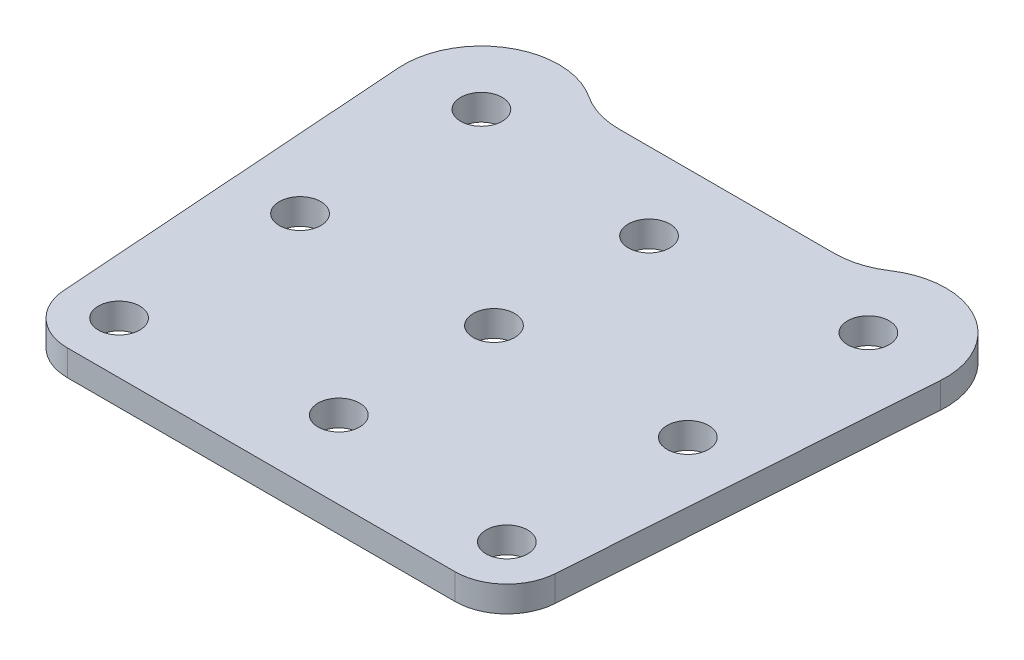
ISO-10303-21;
HEADER;
FILE_DESCRIPTION(('STEP AP214'),'2;1');
FILE_NAME('part.step','',(''),(''),'','','');
FILE_SCHEMA(('AUTOMOTIVE_DESIGN { 1 0 10303 214 1 1 1 1 }'));
ENDSEC;
DATA;
#1=APPLICATION_CONTEXT('core data for automotive mechanical design processes');
#2=APPLICATION_PROTOCOL_DEFINITION('international standard','automotive_design',2000,#1);
#3=PRODUCT_CONTEXT('',#1,'mechanical');
#4=PRODUCT('Part','Part','',(#3));
#5=PRODUCT_RELATED_PRODUCT_CATEGORY('part','',(#4));
#6=PRODUCT_DEFINITION_FORMATION('','',#4);
#7=PRODUCT_DEFINITION_CONTEXT('part definition',#1,'design');
#8=PRODUCT_DEFINITION('design','',#6,#7);
#9=PRODUCT_DEFINITION_SHAPE('','',#8);
#10=(LENGTH_UNIT() NAMED_UNIT(*) SI_UNIT(.MILLI.,.METRE.));
#11=(NAMED_UNIT(*) PLANE_ANGLE_UNIT() SI_UNIT($,.RADIAN.));
#12=(NAMED_UNIT(*) SI_UNIT($,.STERADIAN.) SOLID_ANGLE_UNIT());
#13=UNCERTAINTY_MEASURE_WITH_UNIT(LENGTH_MEASURE(1.E-05),#10,'distance_accuracy_value','');
#14=(GEOMETRIC_REPRESENTATION_CONTEXT(3) GLOBAL_UNCERTAINTY_ASSIGNED_CONTEXT((#13)) GLOBAL_UNIT_ASSIGNED_CONTEXT((#10,
#11,#12)) REPRESENTATION_CONTEXT('',''));
#15=CARTESIAN_POINT('',(0.,0.,0.));
#16=DIRECTION('',(0.,0.,1.));
#17=DIRECTION('',(1.,0.,0.));
#18=AXIS2_PLACEMENT_3D('',#15,#16,#17);
#19=CARTESIAN_POINT('',(-23.7635034,3.175,-31.7500000000001));
#20=DIRECTION('',(0.,1.,0.));
#21=DIRECTION('',(0.,0.,1.));
#22=AXIS2_PLACEMENT_3D('',#19,#20,#21);
#23=PLANE('',#22);
#24=CARTESIAN_POINT('',(23.8125,3.175,-9.52500000000001));
#25=DIRECTION('',(0.,-1.,0.));
#26=DIRECTION('',(0.,0.,-1.));
#27=AXIS2_PLACEMENT_3D('',#24,#25,#26);
#28=CIRCLE('',#27,2.5527);
#29=CARTESIAN_POINT('',(23.8125,3.175,-12.0777));
#30=VERTEX_POINT('',#29);
#31=EDGE_CURVE('E188',#30,#30,#28,.T.);
#32=ORIENTED_EDGE('',*,*,#31,.T.);
#33=EDGE_LOOP('',(#32));
#34=FACE_BOUND('',#33,.T.);
#35=CARTESIAN_POINT('',(23.8125,3.175,12.7));
#36=DIRECTION('',(0.,-1.,0.));
#37=DIRECTION('',(0.,0.,-1.));
#38=AXIS2_PLACEMENT_3D('',#35,#36,#37);
#39=CIRCLE('',#38,2.55269999999999);
#40=CARTESIAN_POINT('',(23.8125,3.175,10.1473000000001));
#41=VERTEX_POINT('',#40);
#42=EDGE_CURVE('E196',#41,#41,#39,.T.);
#43=ORIENTED_EDGE('',*,*,#42,.T.);
#44=EDGE_LOOP('',(#43));
#45=FACE_BOUND('',#44,.T.);
#46=CARTESIAN_POINT('',(0.,3.175,-28.575));
#47=DIRECTION('',(0.,-1.,0.));
#48=DIRECTION('',(0.,0.,-1.));
#49=AXIS2_PLACEMENT_3D('',#46,#47,#48);
#50=CIRCLE('',#49,2.5527);
#51=CARTESIAN_POINT('',(0.,3.175,-31.1277));
#52=VERTEX_POINT('',#51);
#53=EDGE_CURVE('E206',#52,#52,#50,.T.);
#54=ORIENTED_EDGE('',*,*,#53,.T.);
#55=EDGE_LOOP('',(#54));
#56=FACE_BOUND('',#55,.T.);
#57=CARTESIAN_POINT('',(0.,3.175,-9.52500000000001));
#58=DIRECTION('',(0.,-1.,0.));
#59=DIRECTION('',(0.,0.,-1.));
#60=AXIS2_PLACEMENT_3D('',#57,#58,#59);
#61=CIRCLE('',#60,2.5527);
#62=CARTESIAN_POINT('',(0.,3.175,-12.0777));
#63=VERTEX_POINT('',#62);
#64=EDGE_CURVE('E216',#63,#63,#61,.T.);
#65=ORIENTED_EDGE('',*,*,#64,.T.);
#66=EDGE_LOOP('',(#65));
#67=FACE_BOUND('',#66,.T.);
#68=CARTESIAN_POINT('',(-23.7635034,3.175,-31.7500000000001));
#69=DIRECTION('',(0.,-1.,0.));
#70=DIRECTION('',(0.,0.,-1.));
#71=AXIS2_PLACEMENT_3D('',#68,#69,#70);
#72=CIRCLE('',#71,2.5527);
#73=CARTESIAN_POINT('',(-23.7635034,3.175,-34.3027000000001));
#74=VERTEX_POINT('',#73);
#75=EDGE_CURVE('E226',#74,#74,#72,.T.);
#76=ORIENTED_EDGE('',*,*,#75,.T.);
#77=EDGE_LOOP('',(#76));
#78=FACE_BOUND('',#77,.T.);
#79=DIRECTION('',(1.,0.,0.));
#80=VECTOR('',#79,1.);
#81=CARTESIAN_POINT('',(-13.2332196906216,3.175,-38.1));
#82=LINE('',#81,#80);
#83=CARTESIAN_POINT('',(13.2332196906216,3.175,-38.1));
#84=VERTEX_POINT('',#83);
#85=CARTESIAN_POINT('',(-13.2332196906216,3.175,-38.1));
#86=VERTEX_POINT('',#85);
#87=EDGE_CURVE('E117',#84,#86,#82,.F.);
#88=ORIENTED_EDGE('',*,*,#87,.T.);
#89=CARTESIAN_POINT('',(-13.2332196906216,3.175,-47.625));
#90=DIRECTION('',(0.,-1.,0.));
#91=DIRECTION('',(0.,0.,-1.));
#92=AXIS2_PLACEMENT_3D('',#89,#90,#91);
#93=CIRCLE('',#92,9.52500000000001);
#94=CARTESIAN_POINT('',(-18.4983615453108,3.175,-39.6875));
#95=VERTEX_POINT('',#94);
#96=EDGE_CURVE('E235',#86,#95,#93,.T.);
#97=ORIENTED_EDGE('',*,*,#96,.T.);
#98=CARTESIAN_POINT('',(-23.7635034,3.175,-31.7500000000001));
#99=DIRECTION('',(0.,-1.,0.));
#100=DIRECTION('',(0.,0.,-1.));
#101=AXIS2_PLACEMENT_3D('',#98,#99,#100);
#102=CIRCLE('',#101,9.52500000000001);
#103=CARTESIAN_POINT('',(-33.2649180631843,3.175,-31.0801161307916));
#104=VERTEX_POINT('',#103);
#105=EDGE_CURVE('E103',#104,#95,#102,.T.);
#106=ORIENTED_EDGE('',*,*,#105,.F.);
#107=DIRECTION('',(-0.0703290151399907,0.,-0.997523849153211));
#108=VECTOR('',#107,1.);
#109=CARTESIAN_POINT('',(-33.2649180631843,3.175,-31.0801161307916));
#110=LINE('',#109,#108);
#111=CARTESIAN_POINT('',(-30.1467764421229,3.175,13.1465892461389));
#112=VERTEX_POINT('',#111);
#113=EDGE_CURVE('E99',#104,#112,#110,.F.);
#114=ORIENTED_EDGE('',*,*,#113,.T.);
#115=CARTESIAN_POINT('',(-23.8125,3.175,12.6999999999999));
#116=DIRECTION('',(0.,-1.,0.));
#117=DIRECTION('',(0.,0.,-1.));
#118=AXIS2_PLACEMENT_3D('',#115,#116,#117);
#119=CIRCLE('',#118,6.35);
#120=CARTESIAN_POINT('',(-23.8125,3.175,19.05));
#121=VERTEX_POINT('',#120);
#122=EDGE_CURVE('E19',#121,#112,#119,.T.);
#123=ORIENTED_EDGE('',*,*,#122,.F.);
#124=DIRECTION('',(-1.,0.,0.));
#125=VECTOR('',#124,1.);
#126=CARTESIAN_POINT('',(-23.8125,3.175,19.05));
#127=LINE('',#126,#125);
#128=CARTESIAN_POINT('',(23.8125,3.175,19.05));
#129=VERTEX_POINT('',#128);
#130=EDGE_CURVE('E113',#121,#129,#127,.F.);
#131=ORIENTED_EDGE('',*,*,#130,.T.);
#132=CARTESIAN_POINT('',(23.8125,3.175,12.7));
#133=DIRECTION('',(0.,-1.,0.));
#134=DIRECTION('',(0.,0.,-1.));
#135=AXIS2_PLACEMENT_3D('',#132,#133,#134);
#136=CIRCLE('',#135,6.35);
#137=CARTESIAN_POINT('',(30.1467764421229,3.175,13.146589246139));
#138=VERTEX_POINT('',#137);
#139=EDGE_CURVE('E126',#138,#129,#136,.T.);
#140=ORIENTED_EDGE('',*,*,#139,.F.);
#141=DIRECTION('',(-0.0703290151399901,0.,0.997523849153211));
#142=VECTOR('',#141,1.);
#143=CARTESIAN_POINT('',(33.2649180631843,3.175,-31.0801161307915));
#144=LINE('',#143,#142);
#145=CARTESIAN_POINT('',(33.2649180631843,3.175,-31.0801161307915));
#146=VERTEX_POINT('',#145);
#147=EDGE_CURVE('E121',#138,#146,#144,.F.);
#148=ORIENTED_EDGE('',*,*,#147,.T.);
#149=CARTESIAN_POINT('',(23.7635034,3.175,-31.7499999999999));
#150=DIRECTION('',(0.,-1.,0.));
#151=DIRECTION('',(0.,0.,-1.));
#152=AXIS2_PLACEMENT_3D('',#149,#150,#151);
#153=CIRCLE('',#152,9.52500000000001);
#154=CARTESIAN_POINT('',(18.4983615453108,3.175,-39.6875));
#155=VERTEX_POINT('',#154);
#156=EDGE_CURVE('E124',#155,#146,#153,.T.);
#157=ORIENTED_EDGE('',*,*,#156,.F.);
#158=CARTESIAN_POINT('',(13.2332196906216,3.175,-47.625));
#159=DIRECTION('',(0.,-1.,0.));
#160=DIRECTION('',(0.,0.,-1.));
#161=AXIS2_PLACEMENT_3D('',#158,#159,#160);
#162=CIRCLE('',#161,9.52500000000001);
#163=EDGE_CURVE('E237',#155,#84,#162,.T.);
#164=ORIENTED_EDGE('',*,*,#163,.T.);
#165=EDGE_LOOP('',(#88,#97,#106,#114,#123,#131,#140,#148,#157,#164));
#166=FACE_BOUND('',#165,.T.);
#167=CARTESIAN_POINT('',(23.7635034,3.175,-31.7499999999999));
#168=DIRECTION('',(0.,-1.,0.));
#169=DIRECTION('',(0.,0.,-1.));
#170=AXIS2_PLACEMENT_3D('',#167,#168,#169);
#171=CIRCLE('',#170,2.55269999999999);
#172=CARTESIAN_POINT('',(23.7635034,3.175,-34.3026999999999));
#173=VERTEX_POINT('',#172);
#174=EDGE_CURVE('E221',#173,#173,#171,.T.);
#175=ORIENTED_EDGE('',*,*,#174,.T.);
#176=EDGE_LOOP('',(#175));
#177=FACE_BOUND('',#176,.T.);
#178=CARTESIAN_POINT('',(0.,3.175,9.52500000000001));
#179=DIRECTION('',(0.,-1.,0.));
#180=DIRECTION('',(0.,0.,-1.));
#181=AXIS2_PLACEMENT_3D('',#178,#179,#180);
#182=CIRCLE('',#181,2.5527);
#183=CARTESIAN_POINT('',(0.,3.175,6.97230000000001));
#184=VERTEX_POINT('',#183);
#185=EDGE_CURVE('E211',#184,#184,#182,.T.);
#186=ORIENTED_EDGE('',*,*,#185,.T.);
#187=EDGE_LOOP('',(#186));
#188=FACE_BOUND('',#187,.T.);
#189=CARTESIAN_POINT('',(-23.8125,3.175,12.6999999999999));
#190=DIRECTION('',(0.,-1.,0.));
#191=DIRECTION('',(0.,0.,-1.));
#192=AXIS2_PLACEMENT_3D('',#189,#190,#191);
#193=CIRCLE('',#192,2.5527);
#194=CARTESIAN_POINT('',(-23.8125,3.175,10.1472999999999));
#195=VERTEX_POINT('',#194);
#196=EDGE_CURVE('E201',#195,#195,#193,.T.);
#197=ORIENTED_EDGE('',*,*,#196,.T.);
#198=EDGE_LOOP('',(#197));
#199=FACE_BOUND('',#198,.T.);
#200=CARTESIAN_POINT('',(-23.8125,3.175,-9.52500000000001));
#201=DIRECTION('',(0.,-1.,0.));
#202=DIRECTION('',(0.,0.,-1.));
#203=AXIS2_PLACEMENT_3D('',#200,#201,#202);
#204=CIRCLE('',#203,2.5527);
#205=CARTESIAN_POINT('',(-23.8125,3.175,-12.0777));
#206=VERTEX_POINT('',#205);
#207=EDGE_CURVE('E191',#206,#206,#204,.T.);
#208=ORIENTED_EDGE('',*,*,#207,.T.);
#209=EDGE_LOOP('',(#208));
#210=FACE_BOUND('',#209,.T.);
#211=ADVANCED_FACE('F16',(#34,#45,#56,#67,#78,#166,#177,#188,#199,#210),#23,.T.);
#212=CARTESIAN_POINT('',(-33.2649180631843,3.175,-31.0801161307916));
#213=DIRECTION('',(0.997523849153211,0.,-0.0703290151399907));
#214=DIRECTION('',(-0.0703290151399907,0.,-0.997523849153211));
#215=AXIS2_PLACEMENT_3D('',#212,#213,#214);
#216=PLANE('',#215);
#217=DIRECTION('',(0.,-1.,0.));
#218=VECTOR('',#217,1.);
#219=CARTESIAN_POINT('',(-30.1467764421229,3.175,13.1465892461389));
#220=LINE('',#219,#218);
#221=CARTESIAN_POINT('',(-30.1467764421229,0.,13.1465892461389));
#222=VERTEX_POINT('',#221);
#223=EDGE_CURVE('E96',#112,#222,#220,.T.);
#224=ORIENTED_EDGE('',*,*,#223,.F.);
#225=ORIENTED_EDGE('',*,*,#113,.F.);
#226=DIRECTION('',(0.,-1.,0.));
#227=VECTOR('',#226,1.);
#228=CARTESIAN_POINT('',(-33.2649180631844,3.175,-31.0801161307916));
#229=LINE('',#228,#227);
#230=CARTESIAN_POINT('',(-33.2649180631843,0.,-31.0801161307916));
#231=VERTEX_POINT('',#230);
#232=EDGE_CURVE('E234',#231,#104,#229,.F.);
#233=ORIENTED_EDGE('',*,*,#232,.F.);
#234=DIRECTION('',(0.0703290151399907,0.,0.997523849153211));
#235=VECTOR('',#234,1.);
#236=CARTESIAN_POINT('',(-33.2649180631843,0.,-31.0801161307916));
#237=LINE('',#236,#235);
#238=EDGE_CURVE('E111',#231,#222,#237,.T.);
#239=ORIENTED_EDGE('',*,*,#238,.T.);
#240=EDGE_LOOP('',(#224,#225,#233,#239));
#241=FACE_BOUND('',#240,.T.);
#242=ADVANCED_FACE('F109',(#241),#216,.F.);
#243=CARTESIAN_POINT('',(-23.8125,3.175,12.6999999999999));
#244=DIRECTION('',(0.,-1.,0.));
#245=DIRECTION('',(0.,0.,-1.));
#246=AXIS2_PLACEMENT_3D('',#243,#244,#245);
#247=CYLINDRICAL_SURFACE('',#246,6.35);
#248=ORIENTED_EDGE('',*,*,#122,.T.);
#249=ORIENTED_EDGE('',*,*,#223,.T.);
#250=CARTESIAN_POINT('',(-23.8125,0.,12.6999999999999));
#251=DIRECTION('',(0.,-1.,0.));
#252=DIRECTION('',(0.,0.,-1.));
#253=AXIS2_PLACEMENT_3D('',#250,#251,#252);
#254=CIRCLE('',#253,6.35);
#255=CARTESIAN_POINT('',(-23.8125,0.,19.05));
#256=VERTEX_POINT('',#255);
#257=EDGE_CURVE('E186',#222,#256,#254,.F.);
#258=ORIENTED_EDGE('',*,*,#257,.T.);
#259=DIRECTION('',(0.,1.,0.));
#260=VECTOR('',#259,1.);
#261=CARTESIAN_POINT('',(-23.8125,3.175,19.05));
#262=LINE('',#261,#260);
#263=EDGE_CURVE('E98',#256,#121,#262,.T.);
#264=ORIENTED_EDGE('',*,*,#263,.T.);
#265=EDGE_LOOP('',(#248,#249,#258,#264));
#266=FACE_BOUND('',#265,.T.);
#267=ADVANCED_FACE('F93',(#266),#247,.T.);
#268=CARTESIAN_POINT('',(-23.8125,3.175,19.05));
#269=DIRECTION('',(0.,0.,-1.));
#270=DIRECTION('',(-1.,0.,0.));
#271=AXIS2_PLACEMENT_3D('',#268,#269,#270);
#272=PLANE('',#271);
#273=DIRECTION('',(0.,-1.,0.));
#274=VECTOR('',#273,1.);
#275=CARTESIAN_POINT('',(23.8125,3.175,19.05));
#276=LINE('',#275,#274);
#277=CARTESIAN_POINT('',(23.8125,0.,19.05));
#278=VERTEX_POINT('',#277);
#279=EDGE_CURVE('E241',#129,#278,#276,.T.);
#280=ORIENTED_EDGE('',*,*,#279,.F.);
#281=ORIENTED_EDGE('',*,*,#130,.F.);
#282=ORIENTED_EDGE('',*,*,#263,.F.);
#283=DIRECTION('',(1.,0.,0.));
#284=VECTOR('',#283,1.);
#285=CARTESIAN_POINT('',(-23.7635034,0.,19.05));
#286=LINE('',#285,#284);
#287=EDGE_CURVE('E185',#256,#278,#286,.T.);
#288=ORIENTED_EDGE('',*,*,#287,.T.);
#289=EDGE_LOOP('',(#280,#281,#282,#288));
#290=FACE_BOUND('',#289,.T.);
#291=ADVANCED_FACE('F285',(#290),#272,.F.);
#292=CARTESIAN_POINT('',(23.8125,3.175,12.7));
#293=DIRECTION('',(0.,-1.,0.));
#294=DIRECTION('',(0.,0.,-1.));
#295=AXIS2_PLACEMENT_3D('',#292,#293,#294);
#296=CYLINDRICAL_SURFACE('',#295,6.35);
#297=ORIENTED_EDGE('',*,*,#139,.T.);
#298=ORIENTED_EDGE('',*,*,#279,.T.);
#299=CARTESIAN_POINT('',(23.8125,0.,12.7));
#300=DIRECTION('',(0.,-1.,0.));
#301=DIRECTION('',(0.,0.,-1.));
#302=AXIS2_PLACEMENT_3D('',#299,#300,#301);
#303=CIRCLE('',#302,6.35);
#304=CARTESIAN_POINT('',(30.1467764421229,0.,13.146589246139));
#305=VERTEX_POINT('',#304);
#306=EDGE_CURVE('E182',#278,#305,#303,.F.);
#307=ORIENTED_EDGE('',*,*,#306,.T.);
#308=DIRECTION('',(0.,1.,0.));
#309=VECTOR('',#308,1.);
#310=CARTESIAN_POINT('',(30.1467764421229,3.175,13.146589246139));
#311=LINE('',#310,#309);
#312=EDGE_CURVE('E125',#305,#138,#311,.T.);
#313=ORIENTED_EDGE('',*,*,#312,.T.);
#314=EDGE_LOOP('',(#297,#298,#307,#313));
#315=FACE_BOUND('',#314,.T.);
#316=ADVANCED_FACE('F282',(#315),#296,.T.);
#317=CARTESIAN_POINT('',(33.2649180631843,3.175,-31.0801161307915));
#318=DIRECTION('',(-0.997523849153211,0.,-0.0703290151399901));
#319=DIRECTION('',(-0.0703290151399901,0.,0.997523849153211));
#320=AXIS2_PLACEMENT_3D('',#317,#318,#319);
#321=PLANE('',#320);
#322=DIRECTION('',(0.,-1.,0.));
#323=VECTOR('',#322,1.);
#324=CARTESIAN_POINT('',(33.2649180631843,3.175,-31.0801161307915));
#325=LINE('',#324,#323);
#326=CARTESIAN_POINT('',(33.2649180631843,0.,-31.0801161307915));
#327=VERTEX_POINT('',#326);
#328=EDGE_CURVE('E240',#146,#327,#325,.T.);
#329=ORIENTED_EDGE('',*,*,#328,.F.);
#330=ORIENTED_EDGE('',*,*,#147,.F.);
#331=ORIENTED_EDGE('',*,*,#312,.F.);
#332=DIRECTION('',(0.0703290151399903,0.,-0.997523849153212));
#333=VECTOR('',#332,1.);
#334=CARTESIAN_POINT('',(30.1467764421229,0.,13.146589246139));
#335=LINE('',#334,#333);
#336=EDGE_CURVE('E181',#305,#327,#335,.T.);
#337=ORIENTED_EDGE('',*,*,#336,.T.);
#338=EDGE_LOOP('',(#329,#330,#331,#337));
#339=FACE_BOUND('',#338,.T.);
#340=ADVANCED_FACE('F280',(#339),#321,.F.);
#341=CARTESIAN_POINT('',(23.7635034,3.175,-31.7499999999999));
#342=DIRECTION('',(0.,-1.,0.));
#343=DIRECTION('',(0.,0.,-1.));
#344=AXIS2_PLACEMENT_3D('',#341,#342,#343);
#345=CYLINDRICAL_SURFACE('',#344,9.52500000000001);
#346=ORIENTED_EDGE('',*,*,#156,.T.);
#347=ORIENTED_EDGE('',*,*,#328,.T.);
#348=CARTESIAN_POINT('',(23.7635034,0.,-31.7499999999999));
#349=DIRECTION('',(0.,-1.,0.));
#350=DIRECTION('',(0.,0.,-1.));
#351=AXIS2_PLACEMENT_3D('',#348,#349,#350);
#352=CIRCLE('',#351,9.52500000000001);
#353=CARTESIAN_POINT('',(18.4983615453108,0.,-39.6875));
#354=VERTEX_POINT('',#353);
#355=EDGE_CURVE('E178',#327,#354,#352,.F.);
#356=ORIENTED_EDGE('',*,*,#355,.T.);
#357=DIRECTION('',(0.,-1.,0.));
#358=VECTOR('',#357,1.);
#359=CARTESIAN_POINT('',(18.4983615453108,3.175,-39.6875));
#360=LINE('',#359,#358);
#361=EDGE_CURVE('E239',#354,#155,#360,.F.);
#362=ORIENTED_EDGE('',*,*,#361,.T.);
#363=EDGE_LOOP('',(#346,#347,#356,#362));
#364=FACE_BOUND('',#363,.T.);
#365=ADVANCED_FACE('F276',(#364),#345,.T.);
#366=CARTESIAN_POINT('',(13.2332196906216,3.175,-47.625));
#367=DIRECTION('',(0.,-1.,0.));
#368=DIRECTION('',(0.,0.,-1.));
#369=AXIS2_PLACEMENT_3D('',#366,#367,#368);
#370=CYLINDRICAL_SURFACE('',#369,9.52500000000001);
#371=DIRECTION('',(0.,1.,0.));
#372=VECTOR('',#371,1.);
#373=CARTESIAN_POINT('',(13.2332196906216,3.175,-38.1));
#374=LINE('',#373,#372);
#375=CARTESIAN_POINT('',(13.2332196906216,0.,-38.1));
#376=VERTEX_POINT('',#375);
#377=EDGE_CURVE('E120',#376,#84,#374,.T.);
#378=ORIENTED_EDGE('',*,*,#377,.T.);
#379=ORIENTED_EDGE('',*,*,#163,.F.);
#380=ORIENTED_EDGE('',*,*,#361,.F.);
#381=CARTESIAN_POINT('',(13.2332196906216,0.,-47.625));
#382=DIRECTION('',(0.,-1.,0.));
#383=DIRECTION('',(0.,0.,-1.));
#384=AXIS2_PLACEMENT_3D('',#381,#382,#383);
#385=CIRCLE('',#384,9.52500000000001);
#386=EDGE_CURVE('E175',#354,#376,#385,.T.);
#387=ORIENTED_EDGE('',*,*,#386,.T.);
#388=EDGE_LOOP('',(#378,#379,#380,#387));
#389=FACE_BOUND('',#388,.T.);
#390=ADVANCED_FACE('F273',(#389),#370,.F.);
#391=CARTESIAN_POINT('',(-13.2332196906216,3.175,-38.1));
#392=DIRECTION('',(0.,0.,1.));
#393=DIRECTION('',(1.,0.,0.));
#394=AXIS2_PLACEMENT_3D('',#391,#392,#393);
#395=PLANE('',#394);
#396=DIRECTION('',(0.,-1.,0.));
#397=VECTOR('',#396,1.);
#398=CARTESIAN_POINT('',(-13.2332196906216,3.175,-38.1));
#399=LINE('',#398,#397);
#400=CARTESIAN_POINT('',(-13.2332196906216,0.,-38.1));
#401=VERTEX_POINT('',#400);
#402=EDGE_CURVE('E119',#401,#86,#399,.F.);
#403=ORIENTED_EDGE('',*,*,#402,.T.);
#404=ORIENTED_EDGE('',*,*,#87,.F.);
#405=ORIENTED_EDGE('',*,*,#377,.F.);
#406=DIRECTION('',(1.,0.,0.));
#407=VECTOR('',#406,1.);
#408=CARTESIAN_POINT('',(-23.7635034,0.,-38.1));
#409=LINE('',#408,#407);
#410=EDGE_CURVE('E174',#376,#401,#409,.F.);
#411=ORIENTED_EDGE('',*,*,#410,.T.);
#412=EDGE_LOOP('',(#403,#404,#405,#411));
#413=FACE_BOUND('',#412,.T.);
#414=ADVANCED_FACE('F265',(#413),#395,.F.);
#415=CARTESIAN_POINT('',(-13.2332196906216,3.175,-47.625));
#416=DIRECTION('',(0.,-1.,0.));
#417=DIRECTION('',(0.,0.,-1.));
#418=AXIS2_PLACEMENT_3D('',#415,#416,#417);
#419=CYLINDRICAL_SURFACE('',#418,9.52500000000001);
#420=DIRECTION('',(0.,-1.,0.));
#421=VECTOR('',#420,1.);
#422=CARTESIAN_POINT('',(-18.4983615453108,3.175,-39.6875));
#423=LINE('',#422,#421);
#424=CARTESIAN_POINT('',(-18.4983615453108,0.,-39.6875));
#425=VERTEX_POINT('',#424);
#426=EDGE_CURVE('E34',#95,#425,#423,.T.);
#427=ORIENTED_EDGE('',*,*,#426,.F.);
#428=ORIENTED_EDGE('',*,*,#96,.F.);
#429=ORIENTED_EDGE('',*,*,#402,.F.);
#430=CARTESIAN_POINT('',(-13.2332196906216,0.,-47.625));
#431=DIRECTION('',(0.,-1.,0.));
#432=DIRECTION('',(0.,0.,-1.));
#433=AXIS2_PLACEMENT_3D('',#430,#431,#432);
#434=CIRCLE('',#433,9.52500000000001);
#435=EDGE_CURVE('E171',#401,#425,#434,.T.);
#436=ORIENTED_EDGE('',*,*,#435,.T.);
#437=EDGE_LOOP('',(#427,#428,#429,#436));
#438=FACE_BOUND('',#437,.T.);
#439=ADVANCED_FACE('F288',(#438),#419,.F.);
#440=CARTESIAN_POINT('',(-23.7635034,3.175,-31.7500000000001));
#441=DIRECTION('',(0.,-1.,0.));
#442=DIRECTION('',(0.,0.,-1.));
#443=AXIS2_PLACEMENT_3D('',#440,#441,#442);
#444=CYLINDRICAL_SURFACE('',#443,9.52500000000001);
#445=ORIENTED_EDGE('',*,*,#105,.T.);
#446=ORIENTED_EDGE('',*,*,#426,.T.);
#447=CARTESIAN_POINT('',(-23.7635034,0.,-31.7500000000001));
#448=DIRECTION('',(0.,-1.,0.));
#449=DIRECTION('',(0.,0.,-1.));
#450=AXIS2_PLACEMENT_3D('',#447,#448,#449);
#451=CIRCLE('',#450,9.52500000000001);
#452=EDGE_CURVE('E167',#425,#231,#451,.F.);
#453=ORIENTED_EDGE('',*,*,#452,.T.);
#454=ORIENTED_EDGE('',*,*,#232,.T.);
#455=EDGE_LOOP('',(#445,#446,#453,#454));
#456=FACE_BOUND('',#455,.T.);
#457=ADVANCED_FACE('F290',(#456),#444,.T.);
#458=CARTESIAN_POINT('',(-23.7635034,3.175,-31.7500000000001));
#459=DIRECTION('',(0.,-1.,0.));
#460=DIRECTION('',(0.,0.,-1.));
#461=AXIS2_PLACEMENT_3D('',#458,#459,#460);
#462=CYLINDRICAL_SURFACE('',#461,2.5527);
#463=CARTESIAN_POINT('',(-23.7635034,0.,-31.7500000000001));
#464=DIRECTION('',(0.,-1.,0.));
#465=DIRECTION('',(0.,0.,-1.));
#466=AXIS2_PLACEMENT_3D('',#463,#464,#465);
#467=CIRCLE('',#466,2.5527);
#468=CARTESIAN_POINT('',(-23.7635034,0.,-34.3027000000001));
#469=VERTEX_POINT('',#468);
#470=EDGE_CURVE('E162',#469,#469,#467,.T.);
#471=ORIENTED_EDGE('',*,*,#470,.T.);
#472=EDGE_LOOP('',(#471));
#473=FACE_BOUND('',#472,.T.);
#474=ORIENTED_EDGE('',*,*,#75,.F.);
#475=EDGE_LOOP('',(#474));
#476=FACE_BOUND('',#475,.T.);
#477=ADVANCED_FACE('F297',(#473,#476),#462,.F.);
#478=CARTESIAN_POINT('',(23.7635034,3.175,-31.7499999999999));
#479=DIRECTION('',(0.,-1.,0.));
#480=DIRECTION('',(0.,0.,-1.));
#481=AXIS2_PLACEMENT_3D('',#478,#479,#480);
#482=CYLINDRICAL_SURFACE('',#481,2.55269999999999);
#483=CARTESIAN_POINT('',(23.7635034,0.,-31.7499999999999));
#484=DIRECTION('',(0.,-1.,0.));
#485=DIRECTION('',(0.,0.,-1.));
#486=AXIS2_PLACEMENT_3D('',#483,#484,#485);
#487=CIRCLE('',#486,2.55269999999999);
#488=CARTESIAN_POINT('',(23.7635034,0.,-34.3026999999999));
#489=VERTEX_POINT('',#488);
#490=EDGE_CURVE('E157',#489,#489,#487,.T.);
#491=ORIENTED_EDGE('',*,*,#490,.T.);
#492=EDGE_LOOP('',(#491));
#493=FACE_BOUND('',#492,.T.);
#494=ORIENTED_EDGE('',*,*,#174,.F.);
#495=EDGE_LOOP('',(#494));
#496=FACE_BOUND('',#495,.T.);
#497=ADVANCED_FACE('F335',(#493,#496),#482,.F.);
#498=CARTESIAN_POINT('',(0.,3.175,-9.52500000000001));
#499=DIRECTION('',(0.,-1.,0.));
#500=DIRECTION('',(0.,0.,-1.));
#501=AXIS2_PLACEMENT_3D('',#498,#499,#500);
#502=CYLINDRICAL_SURFACE('',#501,2.5527);
#503=CARTESIAN_POINT('',(0.,0.,-9.52500000000001));
#504=DIRECTION('',(0.,-1.,0.));
#505=DIRECTION('',(0.,0.,-1.));
#506=AXIS2_PLACEMENT_3D('',#503,#504,#505);
#507=CIRCLE('',#506,2.5527);
#508=CARTESIAN_POINT('',(0.,0.,-12.0777));
#509=VERTEX_POINT('',#508);
#510=EDGE_CURVE('E152',#509,#509,#507,.T.);
#511=ORIENTED_EDGE('',*,*,#510,.T.);
#512=EDGE_LOOP('',(#511));
#513=FACE_BOUND('',#512,.T.);
#514=ORIENTED_EDGE('',*,*,#64,.F.);
#515=EDGE_LOOP('',(#514));
#516=FACE_BOUND('',#515,.T.);
#517=ADVANCED_FACE('F331',(#513,#516),#502,.F.);
#518=CARTESIAN_POINT('',(0.,3.175,9.52500000000001));
#519=DIRECTION('',(0.,-1.,0.));
#520=DIRECTION('',(0.,0.,-1.));
#521=AXIS2_PLACEMENT_3D('',#518,#519,#520);
#522=CYLINDRICAL_SURFACE('',#521,2.5527);
#523=CARTESIAN_POINT('',(0.,0.,9.52500000000001));
#524=DIRECTION('',(0.,-1.,0.));
#525=DIRECTION('',(0.,0.,-1.));
#526=AXIS2_PLACEMENT_3D('',#523,#524,#525);
#527=CIRCLE('',#526,2.5527);
#528=CARTESIAN_POINT('',(0.,0.,6.97230000000001));
#529=VERTEX_POINT('',#528);
#530=EDGE_CURVE('E147',#529,#529,#527,.T.);
#531=ORIENTED_EDGE('',*,*,#530,.T.);
#532=EDGE_LOOP('',(#531));
#533=FACE_BOUND('',#532,.T.);
#534=ORIENTED_EDGE('',*,*,#185,.F.);
#535=EDGE_LOOP('',(#534));
#536=FACE_BOUND('',#535,.T.);
#537=ADVANCED_FACE('F327',(#533,#536),#522,.F.);
#538=CARTESIAN_POINT('',(0.,3.175,-28.575));
#539=DIRECTION('',(0.,-1.,0.));
#540=DIRECTION('',(0.,0.,-1.));
#541=AXIS2_PLACEMENT_3D('',#538,#539,#540);
#542=CYLINDRICAL_SURFACE('',#541,2.5527);
#543=CARTESIAN_POINT('',(0.,0.,-28.575));
#544=DIRECTION('',(0.,-1.,0.));
#545=DIRECTION('',(0.,0.,-1.));
#546=AXIS2_PLACEMENT_3D('',#543,#544,#545);
#547=CIRCLE('',#546,2.5527);
#548=CARTESIAN_POINT('',(0.,0.,-31.1277));
#549=VERTEX_POINT('',#548);
#550=EDGE_CURVE('E142',#549,#549,#547,.T.);
#551=ORIENTED_EDGE('',*,*,#550,.T.);
#552=EDGE_LOOP('',(#551));
#553=FACE_BOUND('',#552,.T.);
#554=ORIENTED_EDGE('',*,*,#53,.F.);
#555=EDGE_LOOP('',(#554));
#556=FACE_BOUND('',#555,.T.);
#557=ADVANCED_FACE('F323',(#553,#556),#542,.F.);
#558=CARTESIAN_POINT('',(-23.8125,3.175,12.6999999999999));
#559=DIRECTION('',(0.,-1.,0.));
#560=DIRECTION('',(0.,0.,-1.));
#561=AXIS2_PLACEMENT_3D('',#558,#559,#560);
#562=CYLINDRICAL_SURFACE('',#561,2.5527);
#563=CARTESIAN_POINT('',(-23.8125,0.,12.6999999999999));
#564=DIRECTION('',(0.,-1.,0.));
#565=DIRECTION('',(0.,0.,-1.));
#566=AXIS2_PLACEMENT_3D('',#563,#564,#565);
#567=CIRCLE('',#566,2.5527);
#568=CARTESIAN_POINT('',(-23.8125,0.,10.1472999999999));
#569=VERTEX_POINT('',#568);
#570=EDGE_CURVE('E137',#569,#569,#567,.T.);
#571=ORIENTED_EDGE('',*,*,#570,.T.);
#572=EDGE_LOOP('',(#571));
#573=FACE_BOUND('',#572,.T.);
#574=ORIENTED_EDGE('',*,*,#196,.F.);
#575=EDGE_LOOP('',(#574));
#576=FACE_BOUND('',#575,.T.);
#577=ADVANCED_FACE('F319',(#573,#576),#562,.F.);
#578=CARTESIAN_POINT('',(23.8125,3.175,12.7));
#579=DIRECTION('',(0.,-1.,0.));
#580=DIRECTION('',(0.,0.,-1.));
#581=AXIS2_PLACEMENT_3D('',#578,#579,#580);
#582=CYLINDRICAL_SURFACE('',#581,2.55269999999999);
#583=CARTESIAN_POINT('',(23.8125,0.,12.7));
#584=DIRECTION('',(0.,-1.,0.));
#585=DIRECTION('',(0.,0.,-1.));
#586=AXIS2_PLACEMENT_3D('',#583,#584,#585);
#587=CIRCLE('',#586,2.55269999999999);
#588=CARTESIAN_POINT('',(23.8125,0.,10.1473000000001));
#589=VERTEX_POINT('',#588);
#590=EDGE_CURVE('E132',#589,#589,#587,.T.);
#591=ORIENTED_EDGE('',*,*,#590,.T.);
#592=EDGE_LOOP('',(#591));
#593=FACE_BOUND('',#592,.T.);
#594=ORIENTED_EDGE('',*,*,#42,.F.);
#595=EDGE_LOOP('',(#594));
#596=FACE_BOUND('',#595,.T.);
#597=ADVANCED_FACE('F315',(#593,#596),#582,.F.);
#598=CARTESIAN_POINT('',(-23.8125,3.175,-9.52500000000001));
#599=DIRECTION('',(0.,-1.,0.));
#600=DIRECTION('',(0.,0.,-1.));
#601=AXIS2_PLACEMENT_3D('',#598,#599,#600);
#602=CYLINDRICAL_SURFACE('',#601,2.5527);
#603=CARTESIAN_POINT('',(-23.8125,0.,-9.52500000000001));
#604=DIRECTION('',(0.,-1.,0.));
#605=DIRECTION('',(0.,0.,-1.));
#606=AXIS2_PLACEMENT_3D('',#603,#604,#605);
#607=CIRCLE('',#606,2.5527);
#608=CARTESIAN_POINT('',(-23.8125,0.,-12.0777));
#609=VERTEX_POINT('',#608);
#610=EDGE_CURVE('E25',#609,#609,#607,.T.);
#611=ORIENTED_EDGE('',*,*,#610,.T.);
#612=EDGE_LOOP('',(#611));
#613=FACE_BOUND('',#612,.T.);
#614=ORIENTED_EDGE('',*,*,#207,.F.);
#615=EDGE_LOOP('',(#614));
#616=FACE_BOUND('',#615,.T.);
#617=ADVANCED_FACE('F307',(#613,#616),#602,.F.);
#618=CARTESIAN_POINT('',(23.8125,3.175,-9.52500000000001));
#619=DIRECTION('',(0.,-1.,0.));
#620=DIRECTION('',(0.,0.,-1.));
#621=AXIS2_PLACEMENT_3D('',#618,#619,#620);
#622=CYLINDRICAL_SURFACE('',#621,2.5527);
#623=CARTESIAN_POINT('',(23.8125,0.,-9.52500000000001));
#624=DIRECTION('',(0.,-1.,0.));
#625=DIRECTION('',(0.,0.,-1.));
#626=AXIS2_PLACEMENT_3D('',#623,#624,#625);
#627=CIRCLE('',#626,2.5527);
#628=CARTESIAN_POINT('',(23.8125,0.,-12.0777));
#629=VERTEX_POINT('',#628);
#630=EDGE_CURVE('E11',#629,#629,#627,.T.);
#631=ORIENTED_EDGE('',*,*,#630,.T.);
#632=EDGE_LOOP('',(#631));
#633=FACE_BOUND('',#632,.T.);
#634=ORIENTED_EDGE('',*,*,#31,.F.);
#635=EDGE_LOOP('',(#634));
#636=FACE_BOUND('',#635,.T.);
#637=ADVANCED_FACE('F301',(#633,#636),#622,.F.);
#638=CARTESIAN_POINT('',(-23.7635034,0.,-31.7500000000001));
#639=DIRECTION('',(0.,1.,0.));
#640=DIRECTION('',(0.,0.,1.));
#641=AXIS2_PLACEMENT_3D('',#638,#639,#640);
#642=PLANE('',#641);
#643=ORIENTED_EDGE('',*,*,#630,.F.);
#644=EDGE_LOOP('',(#643));
#645=FACE_BOUND('',#644,.T.);
#646=ORIENTED_EDGE('',*,*,#610,.F.);
#647=EDGE_LOOP('',(#646));
#648=FACE_BOUND('',#647,.T.);
#649=ORIENTED_EDGE('',*,*,#590,.F.);
#650=EDGE_LOOP('',(#649));
#651=FACE_BOUND('',#650,.T.);
#652=ORIENTED_EDGE('',*,*,#570,.F.);
#653=EDGE_LOOP('',(#652));
#654=FACE_BOUND('',#653,.T.);
#655=ORIENTED_EDGE('',*,*,#550,.F.);
#656=EDGE_LOOP('',(#655));
#657=FACE_BOUND('',#656,.T.);
#658=ORIENTED_EDGE('',*,*,#530,.F.);
#659=EDGE_LOOP('',(#658));
#660=FACE_BOUND('',#659,.T.);
#661=ORIENTED_EDGE('',*,*,#510,.F.);
#662=EDGE_LOOP('',(#661));
#663=FACE_BOUND('',#662,.T.);
#664=ORIENTED_EDGE('',*,*,#490,.F.);
#665=EDGE_LOOP('',(#664));
#666=FACE_BOUND('',#665,.T.);
#667=ORIENTED_EDGE('',*,*,#470,.F.);
#668=EDGE_LOOP('',(#667));
#669=FACE_BOUND('',#668,.T.);
#670=ORIENTED_EDGE('',*,*,#435,.F.);
#671=ORIENTED_EDGE('',*,*,#410,.F.);
#672=ORIENTED_EDGE('',*,*,#386,.F.);
#673=ORIENTED_EDGE('',*,*,#355,.F.);
#674=ORIENTED_EDGE('',*,*,#336,.F.);
#675=ORIENTED_EDGE('',*,*,#306,.F.);
#676=ORIENTED_EDGE('',*,*,#287,.F.);
#677=ORIENTED_EDGE('',*,*,#257,.F.);
#678=ORIENTED_EDGE('',*,*,#238,.F.);
#679=ORIENTED_EDGE('',*,*,#452,.F.);
#680=EDGE_LOOP('',(#670,#671,#672,#673,#674,#675,#676,#677,#678,#679));
#681=FACE_BOUND('',#680,.T.);
#682=ADVANCED_FACE('F270',(#645,#648,#651,#654,#657,#660,#663,#666,#669,#681),#642,.F.);
#683=CLOSED_SHELL('',(#211,#242,#267,#291,#316,#340,#365,#390,#414,#439,#457,#477,#497,#517,
#537,#557,#577,#597,#617,#637,#682));
#684=MANIFOLD_SOLID_BREP('B1',#683);
#685=ADVANCED_BREP_SHAPE_REPRESENTATION('',(#18,#684),#14);
#686=SHAPE_DEFINITION_REPRESENTATION(#9,#685);
ENDSEC;
END-ISO-10303-21;
